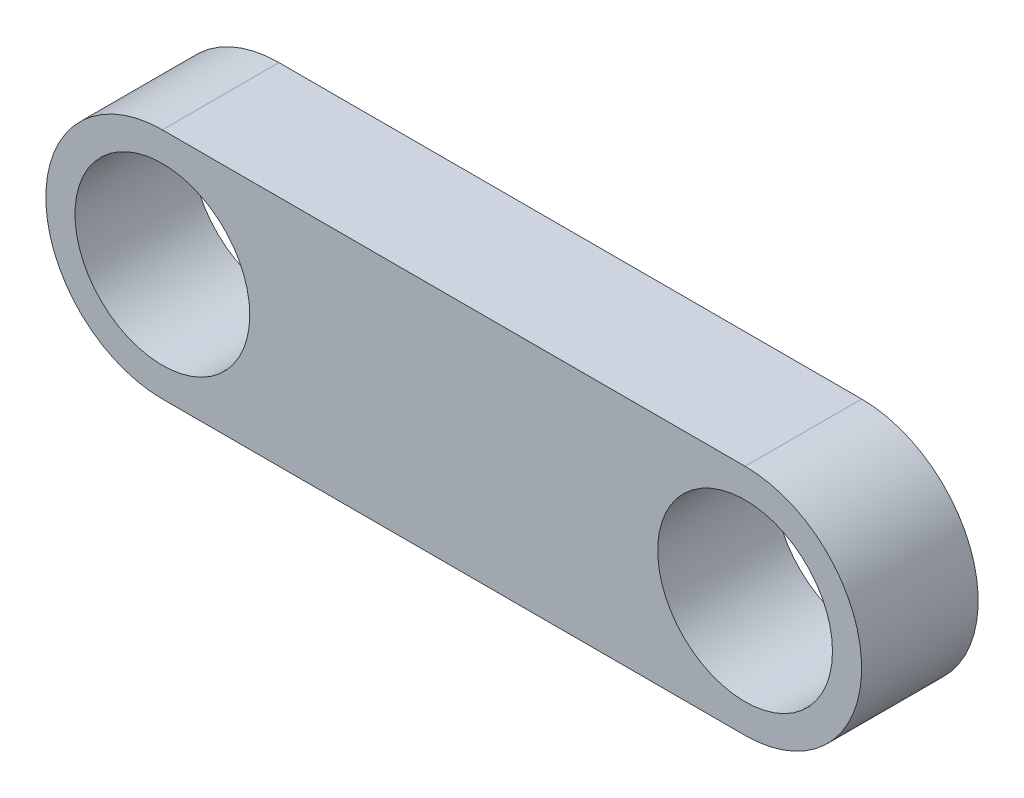
ISO-10303-21;
HEADER;
FILE_DESCRIPTION(('STEP AP214'),'2;1');
FILE_NAME('part.step','',(''),(''),'','','');
FILE_SCHEMA(('AUTOMOTIVE_DESIGN { 1 0 10303 214 1 1 1 1 }'));
ENDSEC;
DATA;
#1=APPLICATION_CONTEXT('core data for automotive mechanical design processes');
#2=APPLICATION_PROTOCOL_DEFINITION('international standard','automotive_design',2000,#1);
#3=PRODUCT_CONTEXT('',#1,'mechanical');
#4=PRODUCT('Part','Part','',(#3));
#5=PRODUCT_RELATED_PRODUCT_CATEGORY('part','',(#4));
#6=PRODUCT_DEFINITION_FORMATION('','',#4);
#7=PRODUCT_DEFINITION_CONTEXT('part definition',#1,'design');
#8=PRODUCT_DEFINITION('design','',#6,#7);
#9=PRODUCT_DEFINITION_SHAPE('','',#8);
#10=(LENGTH_UNIT() NAMED_UNIT(*) SI_UNIT(.MILLI.,.METRE.));
#11=(NAMED_UNIT(*) PLANE_ANGLE_UNIT() SI_UNIT($,.RADIAN.));
#12=(NAMED_UNIT(*) SI_UNIT($,.STERADIAN.) SOLID_ANGLE_UNIT());
#13=UNCERTAINTY_MEASURE_WITH_UNIT(LENGTH_MEASURE(1.E-05),#10,'distance_accuracy_value','');
#14=(GEOMETRIC_REPRESENTATION_CONTEXT(3) GLOBAL_UNCERTAINTY_ASSIGNED_CONTEXT((#13)) GLOBAL_UNIT_ASSIGNED_CONTEXT((#10,
#11,#12)) REPRESENTATION_CONTEXT('',''));
#15=CARTESIAN_POINT('',(0.,0.,0.));
#16=DIRECTION('',(0.,0.,1.));
#17=DIRECTION('',(1.,0.,0.));
#18=AXIS2_PLACEMENT_3D('',#15,#16,#17);
#19=CARTESIAN_POINT('',(-15.4651551222678,-11.3411137563297,2.));
#20=DIRECTION('',(0.,0.,-1.));
#21=DIRECTION('',(-1.,0.,0.));
#22=AXIS2_PLACEMENT_3D('',#19,#20,#21);
#23=PLANE('',#22);
#24=CARTESIAN_POINT('',(-15.4651551222678,-11.3411137563297,2.));
#25=DIRECTION('',(0.,0.,1.));
#26=DIRECTION('',(-1.,0.,0.));
#27=AXIS2_PLACEMENT_3D('',#24,#25,#26);
#28=CIRCLE('',#27,2.);
#29=CARTESIAN_POINT('',(-15.4651551222678,-9.34111375632971,2.));
#30=VERTEX_POINT('',#29);
#31=CARTESIAN_POINT('',(-15.4651551222678,-13.3411137563297,2.));
#32=VERTEX_POINT('',#31);
#33=EDGE_CURVE('E86',#30,#32,#28,.T.);
#34=ORIENTED_EDGE('',*,*,#33,.T.);
#35=DIRECTION('',(1.,0.,0.));
#36=VECTOR('',#35,1.);
#37=CARTESIAN_POINT('',(-15.4651551222678,-13.3411137563297,2.));
#38=LINE('',#37,#36);
#39=CARTESIAN_POINT('',(-5.46515512226779,-13.3411137563297,2.));
#40=VERTEX_POINT('',#39);
#41=EDGE_CURVE('E81',#32,#40,#38,.T.);
#42=ORIENTED_EDGE('',*,*,#41,.T.);
#43=CARTESIAN_POINT('',(-5.46515512226779,-11.3411137563297,2.));
#44=DIRECTION('',(0.,0.,1.));
#45=DIRECTION('',(-1.,0.,0.));
#46=AXIS2_PLACEMENT_3D('',#43,#44,#45);
#47=CIRCLE('',#46,2.);
#48=CARTESIAN_POINT('',(-5.46515512226779,-9.34111375632971,2.));
#49=VERTEX_POINT('',#48);
#50=EDGE_CURVE('E84',#40,#49,#47,.T.);
#51=ORIENTED_EDGE('',*,*,#50,.T.);
#52=DIRECTION('',(-1.,0.,0.));
#53=VECTOR('',#52,1.);
#54=CARTESIAN_POINT('',(-15.4651551222678,-9.34111375632971,2.));
#55=LINE('',#54,#53);
#56=EDGE_CURVE('E51',#49,#30,#55,.T.);
#57=ORIENTED_EDGE('',*,*,#56,.T.);
#58=EDGE_LOOP('',(#34,#42,#51,#57));
#59=FACE_BOUND('',#58,.T.);
#60=CARTESIAN_POINT('',(-15.4651551222678,-11.3411137563297,2.));
#61=DIRECTION('',(0.,0.,1.));
#62=DIRECTION('',(1.,0.,0.));
#63=AXIS2_PLACEMENT_3D('',#60,#61,#62);
#64=CIRCLE('',#63,1.5);
#65=CARTESIAN_POINT('',(-13.9651551222678,-11.3411137563297,2.));
#66=VERTEX_POINT('',#65);
#67=EDGE_CURVE('E101',#66,#66,#64,.T.);
#68=ORIENTED_EDGE('',*,*,#67,.F.);
#69=EDGE_LOOP('',(#68));
#70=FACE_BOUND('',#69,.T.);
#71=CARTESIAN_POINT('',(-5.46515512226779,-11.3411137563297,2.));
#72=DIRECTION('',(0.,0.,1.));
#73=DIRECTION('',(1.,0.,0.));
#74=AXIS2_PLACEMENT_3D('',#71,#72,#73);
#75=CIRCLE('',#74,1.5);
#76=CARTESIAN_POINT('',(-3.96515512226779,-11.3411137563297,2.));
#77=VERTEX_POINT('',#76);
#78=EDGE_CURVE('E116',#77,#77,#75,.T.);
#79=ORIENTED_EDGE('',*,*,#78,.F.);
#80=EDGE_LOOP('',(#79));
#81=FACE_BOUND('',#80,.T.);
#82=ADVANCED_FACE('F34',(#59,#70,#81),#23,.F.);
#83=CARTESIAN_POINT('',(-15.4651551222678,-11.3411137563297,0.));
#84=DIRECTION('',(0.,0.,-1.));
#85=DIRECTION('',(-1.,0.,0.));
#86=AXIS2_PLACEMENT_3D('',#83,#84,#85);
#87=PLANE('',#86);
#88=CARTESIAN_POINT('',(-15.4651551222678,-11.3411137563297,0.));
#89=DIRECTION('',(0.,0.,1.));
#90=DIRECTION('',(1.,0.,0.));
#91=AXIS2_PLACEMENT_3D('',#88,#89,#90);
#92=CIRCLE('',#91,1.5);
#93=CARTESIAN_POINT('',(-13.9651551222678,-11.3411137563297,0.));
#94=VERTEX_POINT('',#93);
#95=EDGE_CURVE('E113',#94,#94,#92,.T.);
#96=ORIENTED_EDGE('',*,*,#95,.T.);
#97=EDGE_LOOP('',(#96));
#98=FACE_BOUND('',#97,.T.);
#99=CARTESIAN_POINT('',(-15.4651551222678,-11.3411137563297,0.));
#100=DIRECTION('',(0.,0.,1.));
#101=DIRECTION('',(-1.,0.,0.));
#102=AXIS2_PLACEMENT_3D('',#99,#100,#101);
#103=CIRCLE('',#102,2.);
#104=CARTESIAN_POINT('',(-15.4651551222678,-9.34111375632971,0.));
#105=VERTEX_POINT('',#104);
#106=CARTESIAN_POINT('',(-15.4651551222678,-13.3411137563297,0.));
#107=VERTEX_POINT('',#106);
#108=EDGE_CURVE('E98',#105,#107,#103,.T.);
#109=ORIENTED_EDGE('',*,*,#108,.F.);
#110=DIRECTION('',(-1.,0.,0.));
#111=VECTOR('',#110,1.);
#112=CARTESIAN_POINT('',(-15.4651551222678,-9.34111375632971,0.));
#113=LINE('',#112,#111);
#114=CARTESIAN_POINT('',(-5.46515512226779,-9.34111375632971,0.));
#115=VERTEX_POINT('',#114);
#116=EDGE_CURVE('E74',#115,#105,#113,.T.);
#117=ORIENTED_EDGE('',*,*,#116,.F.);
#118=CARTESIAN_POINT('',(-5.46515512226779,-11.3411137563297,0.));
#119=DIRECTION('',(0.,0.,1.));
#120=DIRECTION('',(-1.,0.,0.));
#121=AXIS2_PLACEMENT_3D('',#118,#119,#120);
#122=CIRCLE('',#121,2.);
#123=CARTESIAN_POINT('',(-5.46515512226779,-13.3411137563297,0.));
#124=VERTEX_POINT('',#123);
#125=EDGE_CURVE('E68',#124,#115,#122,.T.);
#126=ORIENTED_EDGE('',*,*,#125,.F.);
#127=DIRECTION('',(1.,0.,0.));
#128=VECTOR('',#127,1.);
#129=CARTESIAN_POINT('',(-15.4651551222678,-13.3411137563297,0.));
#130=LINE('',#129,#128);
#131=EDGE_CURVE('E90',#107,#124,#130,.T.);
#132=ORIENTED_EDGE('',*,*,#131,.F.);
#133=EDGE_LOOP('',(#109,#117,#126,#132));
#134=FACE_BOUND('',#133,.T.);
#135=CARTESIAN_POINT('',(-5.46515512226779,-11.3411137563297,0.));
#136=DIRECTION('',(0.,0.,1.));
#137=DIRECTION('',(1.,0.,0.));
#138=AXIS2_PLACEMENT_3D('',#135,#136,#137);
#139=CIRCLE('',#138,1.5);
#140=CARTESIAN_POINT('',(-3.96515512226779,-11.3411137563297,0.));
#141=VERTEX_POINT('',#140);
#142=EDGE_CURVE('E119',#141,#141,#139,.T.);
#143=ORIENTED_EDGE('',*,*,#142,.T.);
#144=EDGE_LOOP('',(#143));
#145=FACE_BOUND('',#144,.T.);
#146=ADVANCED_FACE('F109',(#98,#134,#145),#87,.T.);
#147=CARTESIAN_POINT('',(-15.4651551222678,-11.3411137563297,2.));
#148=DIRECTION('',(0.,0.,-1.));
#149=DIRECTION('',(-1.,0.,0.));
#150=AXIS2_PLACEMENT_3D('',#147,#148,#149);
#151=CYLINDRICAL_SURFACE('',#150,2.);
#152=ORIENTED_EDGE('',*,*,#108,.T.);
#153=DIRECTION('',(0.,0.,-1.));
#154=VECTOR('',#153,1.);
#155=CARTESIAN_POINT('',(-15.4651551222678,-13.3411137563297,2.));
#156=LINE('',#155,#154);
#157=EDGE_CURVE('E11',#32,#107,#156,.T.);
#158=ORIENTED_EDGE('',*,*,#157,.F.);
#159=ORIENTED_EDGE('',*,*,#33,.F.);
#160=DIRECTION('',(0.,0.,-1.));
#161=VECTOR('',#160,1.);
#162=CARTESIAN_POINT('',(-15.4651551222678,-9.34111375632971,2.));
#163=LINE('',#162,#161);
#164=EDGE_CURVE('E94',#30,#105,#163,.T.);
#165=ORIENTED_EDGE('',*,*,#164,.T.);
#166=EDGE_LOOP('',(#152,#158,#159,#165));
#167=FACE_BOUND('',#166,.T.);
#168=ADVANCED_FACE('F36',(#167),#151,.T.);
#169=CARTESIAN_POINT('',(-15.4651551222678,-13.3411137563297,2.));
#170=DIRECTION('',(0.,1.,0.));
#171=DIRECTION('',(0.,0.,1.));
#172=AXIS2_PLACEMENT_3D('',#169,#170,#171);
#173=PLANE('',#172);
#174=ORIENTED_EDGE('',*,*,#131,.T.);
#175=DIRECTION('',(0.,0.,-1.));
#176=VECTOR('',#175,1.);
#177=CARTESIAN_POINT('',(-5.46515512226779,-13.3411137563297,2.));
#178=LINE('',#177,#176);
#179=EDGE_CURVE('E43',#40,#124,#178,.T.);
#180=ORIENTED_EDGE('',*,*,#179,.F.);
#181=ORIENTED_EDGE('',*,*,#41,.F.);
#182=ORIENTED_EDGE('',*,*,#157,.T.);
#183=EDGE_LOOP('',(#174,#180,#181,#182));
#184=FACE_BOUND('',#183,.T.);
#185=ADVANCED_FACE('F89',(#184),#173,.F.);
#186=CARTESIAN_POINT('',(-5.46515512226779,-11.3411137563297,2.));
#187=DIRECTION('',(0.,0.,-1.));
#188=DIRECTION('',(-1.,0.,0.));
#189=AXIS2_PLACEMENT_3D('',#186,#187,#188);
#190=CYLINDRICAL_SURFACE('',#189,2.);
#191=ORIENTED_EDGE('',*,*,#125,.T.);
#192=DIRECTION('',(0.,0.,-1.));
#193=VECTOR('',#192,1.);
#194=CARTESIAN_POINT('',(-5.46515512226779,-9.34111375632971,2.));
#195=LINE('',#194,#193);
#196=EDGE_CURVE('E91',#49,#115,#195,.T.);
#197=ORIENTED_EDGE('',*,*,#196,.F.);
#198=ORIENTED_EDGE('',*,*,#50,.F.);
#199=ORIENTED_EDGE('',*,*,#179,.T.);
#200=EDGE_LOOP('',(#191,#197,#198,#199));
#201=FACE_BOUND('',#200,.T.);
#202=ADVANCED_FACE('F92',(#201),#190,.T.);
#203=CARTESIAN_POINT('',(-15.4651551222678,-9.34111375632971,2.));
#204=DIRECTION('',(0.,-1.,0.));
#205=DIRECTION('',(0.,0.,-1.));
#206=AXIS2_PLACEMENT_3D('',#203,#204,#205);
#207=PLANE('',#206);
#208=ORIENTED_EDGE('',*,*,#116,.T.);
#209=ORIENTED_EDGE('',*,*,#164,.F.);
#210=ORIENTED_EDGE('',*,*,#56,.F.);
#211=ORIENTED_EDGE('',*,*,#196,.T.);
#212=EDGE_LOOP('',(#208,#209,#210,#211));
#213=FACE_BOUND('',#212,.T.);
#214=ADVANCED_FACE('F106',(#213),#207,.F.);
#215=CARTESIAN_POINT('',(-15.4651551222678,-11.3411137563297,2.));
#216=DIRECTION('',(0.,0.,-1.));
#217=DIRECTION('',(-1.,0.,0.));
#218=AXIS2_PLACEMENT_3D('',#215,#216,#217);
#219=CYLINDRICAL_SURFACE('',#218,1.5);
#220=ORIENTED_EDGE('',*,*,#67,.T.);
#221=EDGE_LOOP('',(#220));
#222=FACE_BOUND('',#221,.T.);
#223=ORIENTED_EDGE('',*,*,#95,.F.);
#224=EDGE_LOOP('',(#223));
#225=FACE_BOUND('',#224,.T.);
#226=ADVANCED_FACE('F136',(#222,#225),#219,.F.);
#227=CARTESIAN_POINT('',(-5.46515512226779,-11.3411137563297,2.));
#228=DIRECTION('',(0.,0.,-1.));
#229=DIRECTION('',(-1.,0.,0.));
#230=AXIS2_PLACEMENT_3D('',#227,#228,#229);
#231=CYLINDRICAL_SURFACE('',#230,1.5);
#232=ORIENTED_EDGE('',*,*,#78,.T.);
#233=EDGE_LOOP('',(#232));
#234=FACE_BOUND('',#233,.T.);
#235=ORIENTED_EDGE('',*,*,#142,.F.);
#236=EDGE_LOOP('',(#235));
#237=FACE_BOUND('',#236,.T.);
#238=ADVANCED_FACE('F125',(#234,#237),#231,.F.);
#239=CLOSED_SHELL('',(#82,#146,#168,#185,#202,#214,#226,#238));
#240=MANIFOLD_SOLID_BREP('B2',#239);
#241=ADVANCED_BREP_SHAPE_REPRESENTATION('',(#18,#240),#14);
#242=SHAPE_DEFINITION_REPRESENTATION(#9,#241);
ENDSEC;
END-ISO-10303-21;
